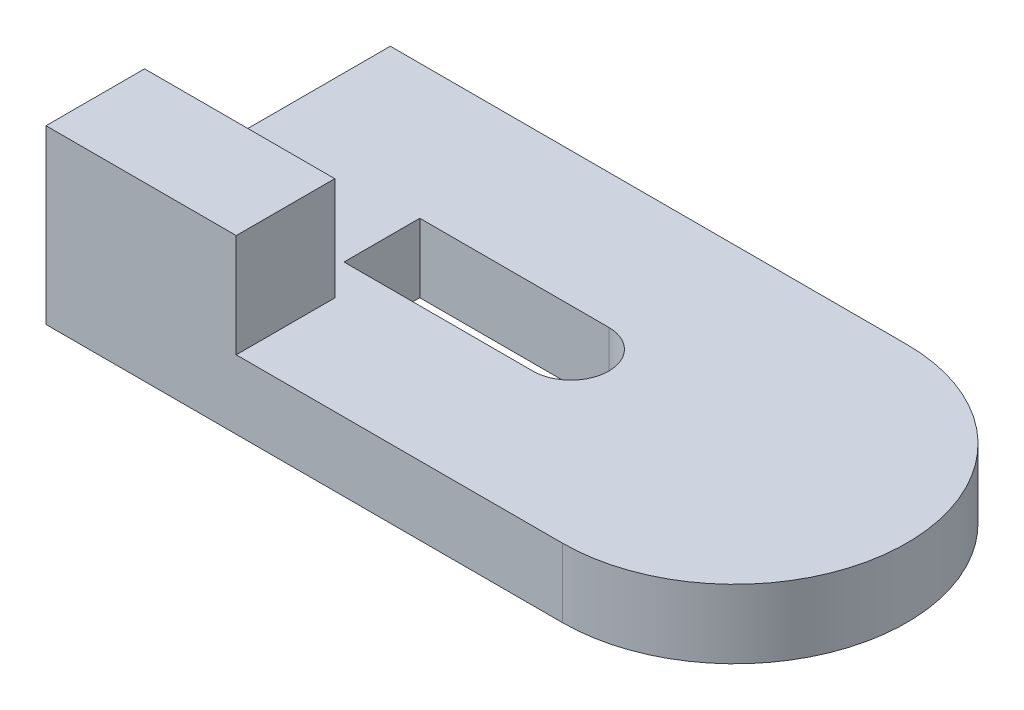
ISO-10303-21;
HEADER;
FILE_DESCRIPTION(('STEP AP214'),'2;1');
FILE_NAME('part.step','',(''),(''),'','','');
FILE_SCHEMA(('AUTOMOTIVE_DESIGN { 1 0 10303 214 1 1 1 1 }'));
ENDSEC;
DATA;
#1=APPLICATION_CONTEXT('core data for automotive mechanical design processes');
#2=APPLICATION_PROTOCOL_DEFINITION('international standard','automotive_design',2000,#1);
#3=PRODUCT_CONTEXT('',#1,'mechanical');
#4=PRODUCT('Part','Part','',(#3));
#5=PRODUCT_RELATED_PRODUCT_CATEGORY('part','',(#4));
#6=PRODUCT_DEFINITION_FORMATION('','',#4);
#7=PRODUCT_DEFINITION_CONTEXT('part definition',#1,'design');
#8=PRODUCT_DEFINITION('design','',#6,#7);
#9=PRODUCT_DEFINITION_SHAPE('','',#8);
#10=(LENGTH_UNIT() NAMED_UNIT(*) SI_UNIT(.MILLI.,.METRE.));
#11=(NAMED_UNIT(*) PLANE_ANGLE_UNIT() SI_UNIT($,.RADIAN.));
#12=(NAMED_UNIT(*) SI_UNIT($,.STERADIAN.) SOLID_ANGLE_UNIT());
#13=UNCERTAINTY_MEASURE_WITH_UNIT(LENGTH_MEASURE(1.E-05),#10,'distance_accuracy_value','');
#14=(GEOMETRIC_REPRESENTATION_CONTEXT(3) GLOBAL_UNCERTAINTY_ASSIGNED_CONTEXT((#13)) GLOBAL_UNIT_ASSIGNED_CONTEXT((#10,
#11,#12)) REPRESENTATION_CONTEXT('',''));
#15=CARTESIAN_POINT('',(0.,0.,0.));
#16=DIRECTION('',(0.,0.,1.));
#17=DIRECTION('',(1.,0.,0.));
#18=AXIS2_PLACEMENT_3D('',#15,#16,#17);
#19=CARTESIAN_POINT('',(75.,20.,0.));
#20=DIRECTION('',(0.,-1.,0.));
#21=DIRECTION('',(0.,0.,-1.));
#22=AXIS2_PLACEMENT_3D('',#19,#20,#21);
#23=CYLINDRICAL_SURFACE('',#22,50.);
#24=CARTESIAN_POINT('',(75.,0.,0.));
#25=DIRECTION('',(0.,1.,0.));
#26=DIRECTION('',(0.,0.,1.));
#27=AXIS2_PLACEMENT_3D('',#24,#25,#26);
#28=CIRCLE('',#27,50.);
#29=CARTESIAN_POINT('',(75.,0.,50.));
#30=VERTEX_POINT('',#29);
#31=CARTESIAN_POINT('',(75.,0.,-50.));
#32=VERTEX_POINT('',#31);
#33=EDGE_CURVE('E183',#30,#32,#28,.T.);
#34=ORIENTED_EDGE('',*,*,#33,.T.);
#35=DIRECTION('',(0.,-1.,0.));
#36=VECTOR('',#35,1.);
#37=CARTESIAN_POINT('',(75.,20.,-50.));
#38=LINE('',#37,#36);
#39=CARTESIAN_POINT('',(75.,20.,-50.));
#40=VERTEX_POINT('',#39);
#41=EDGE_CURVE('E210',#40,#32,#38,.T.);
#42=ORIENTED_EDGE('',*,*,#41,.F.);
#43=CARTESIAN_POINT('',(75.,20.,0.));
#44=DIRECTION('',(0.,1.,0.));
#45=DIRECTION('',(0.,0.,1.));
#46=AXIS2_PLACEMENT_3D('',#43,#44,#45);
#47=CIRCLE('',#46,50.);
#48=CARTESIAN_POINT('',(75.,20.,50.));
#49=VERTEX_POINT('',#48);
#50=EDGE_CURVE('E184',#49,#40,#47,.T.);
#51=ORIENTED_EDGE('',*,*,#50,.F.);
#52=DIRECTION('',(0.,-1.,0.));
#53=VECTOR('',#52,1.);
#54=CARTESIAN_POINT('',(75.,20.,50.));
#55=LINE('',#54,#53);
#56=EDGE_CURVE('E194',#49,#30,#55,.T.);
#57=ORIENTED_EDGE('',*,*,#56,.T.);
#58=EDGE_LOOP('',(#34,#42,#51,#57));
#59=FACE_BOUND('',#58,.T.);
#60=ADVANCED_FACE('F49',(#59),#23,.T.);
#61=CARTESIAN_POINT('',(-75.,20.,-50.));
#62=DIRECTION('',(0.,0.,1.));
#63=DIRECTION('',(1.,0.,0.));
#64=AXIS2_PLACEMENT_3D('',#61,#62,#63);
#65=PLANE('',#64);
#66=DIRECTION('',(-1.,0.,0.));
#67=VECTOR('',#66,1.);
#68=CARTESIAN_POINT('',(-75.,0.,-50.));
#69=LINE('',#68,#67);
#70=CARTESIAN_POINT('',(-75.,0.,-50.));
#71=VERTEX_POINT('',#70);
#72=EDGE_CURVE('E197',#32,#71,#69,.T.);
#73=ORIENTED_EDGE('',*,*,#72,.T.);
#74=DIRECTION('',(0.,-1.,0.));
#75=VECTOR('',#74,1.);
#76=CARTESIAN_POINT('',(-75.,20.,-50.));
#77=LINE('',#76,#75);
#78=CARTESIAN_POINT('',(-75.,20.,-50.));
#79=VERTEX_POINT('',#78);
#80=EDGE_CURVE('E207',#79,#71,#77,.T.);
#81=ORIENTED_EDGE('',*,*,#80,.F.);
#82=DIRECTION('',(-1.,0.,0.));
#83=VECTOR('',#82,1.);
#84=CARTESIAN_POINT('',(-75.,20.,-50.));
#85=LINE('',#84,#83);
#86=EDGE_CURVE('E187',#40,#79,#85,.T.);
#87=ORIENTED_EDGE('',*,*,#86,.F.);
#88=ORIENTED_EDGE('',*,*,#41,.T.);
#89=EDGE_LOOP('',(#73,#81,#87,#88));
#90=FACE_BOUND('',#89,.T.);
#91=ADVANCED_FACE('F235',(#90),#65,.F.);
#92=CARTESIAN_POINT('',(-75.,20.,-50.));
#93=DIRECTION('',(1.,0.,0.));
#94=DIRECTION('',(0.,0.,-1.));
#95=AXIS2_PLACEMENT_3D('',#92,#93,#94);
#96=PLANE('',#95);
#97=DIRECTION('',(0.,0.,1.));
#98=VECTOR('',#97,1.);
#99=CARTESIAN_POINT('',(-75.,0.,-50.));
#100=LINE('',#99,#98);
#101=CARTESIAN_POINT('',(-75.,0.,50.));
#102=VERTEX_POINT('',#101);
#103=EDGE_CURVE('E199',#71,#102,#100,.T.);
#104=ORIENTED_EDGE('',*,*,#103,.T.);
#105=DIRECTION('',(0.,-1.,0.));
#106=VECTOR('',#105,1.);
#107=CARTESIAN_POINT('',(-75.,20.,50.));
#108=LINE('',#107,#106);
#109=CARTESIAN_POINT('',(-75.,50.,50.));
#110=VERTEX_POINT('',#109);
#111=EDGE_CURVE('E204',#110,#102,#108,.T.);
#112=ORIENTED_EDGE('',*,*,#111,.F.);
#113=DIRECTION('',(0.,0.,1.));
#114=VECTOR('',#113,1.);
#115=CARTESIAN_POINT('',(-75.,50.,50.));
#116=LINE('',#115,#114);
#117=CARTESIAN_POINT('',(-75.,50.,21.3811639047776));
#118=VERTEX_POINT('',#117);
#119=EDGE_CURVE('E160',#118,#110,#116,.T.);
#120=ORIENTED_EDGE('',*,*,#119,.F.);
#121=DIRECTION('',(0.,-1.,0.));
#122=VECTOR('',#121,1.);
#123=CARTESIAN_POINT('',(-75.,50.,21.3811639047776));
#124=LINE('',#123,#122);
#125=CARTESIAN_POINT('',(-75.,20.,21.3811639047776));
#126=VERTEX_POINT('',#125);
#127=EDGE_CURVE('E170',#118,#126,#124,.T.);
#128=ORIENTED_EDGE('',*,*,#127,.T.);
#129=DIRECTION('',(0.,0.,1.));
#130=VECTOR('',#129,1.);
#131=CARTESIAN_POINT('',(-75.,20.,-50.));
#132=LINE('',#131,#130);
#133=EDGE_CURVE('E190',#79,#126,#132,.T.);
#134=ORIENTED_EDGE('',*,*,#133,.F.);
#135=ORIENTED_EDGE('',*,*,#80,.T.);
#136=EDGE_LOOP('',(#104,#112,#120,#128,#134,#135));
#137=FACE_BOUND('',#136,.T.);
#138=ADVANCED_FACE('F240',(#137),#96,.F.);
#139=CARTESIAN_POINT('',(-75.,20.,50.));
#140=DIRECTION('',(0.,0.,-1.));
#141=DIRECTION('',(-1.,0.,0.));
#142=AXIS2_PLACEMENT_3D('',#139,#140,#141);
#143=PLANE('',#142);
#144=DIRECTION('',(1.,0.,0.));
#145=VECTOR('',#144,1.);
#146=CARTESIAN_POINT('',(-75.,0.,50.));
#147=LINE('',#146,#145);
#148=EDGE_CURVE('E188',#102,#30,#147,.T.);
#149=ORIENTED_EDGE('',*,*,#148,.T.);
#150=ORIENTED_EDGE('',*,*,#56,.F.);
#151=DIRECTION('',(1.,0.,0.));
#152=VECTOR('',#151,1.);
#153=CARTESIAN_POINT('',(-75.,20.,50.));
#154=LINE('',#153,#152);
#155=CARTESIAN_POINT('',(-19.7456027190128,20.,50.));
#156=VERTEX_POINT('',#155);
#157=EDGE_CURVE('E192',#156,#49,#154,.T.);
#158=ORIENTED_EDGE('',*,*,#157,.F.);
#159=DIRECTION('',(0.,-1.,0.));
#160=VECTOR('',#159,1.);
#161=CARTESIAN_POINT('',(-19.7456027190128,50.,50.));
#162=LINE('',#161,#160);
#163=CARTESIAN_POINT('',(-19.7456027190128,50.,50.));
#164=VERTEX_POINT('',#163);
#165=EDGE_CURVE('E180',#164,#156,#162,.T.);
#166=ORIENTED_EDGE('',*,*,#165,.F.);
#167=DIRECTION('',(1.,0.,0.));
#168=VECTOR('',#167,1.);
#169=CARTESIAN_POINT('',(-75.,50.,50.));
#170=LINE('',#169,#168);
#171=EDGE_CURVE('E163',#110,#164,#170,.T.);
#172=ORIENTED_EDGE('',*,*,#171,.F.);
#173=ORIENTED_EDGE('',*,*,#111,.T.);
#174=EDGE_LOOP('',(#149,#150,#158,#166,#172,#173));
#175=FACE_BOUND('',#174,.T.);
#176=ADVANCED_FACE('F253',(#175),#143,.F.);
#177=CARTESIAN_POINT('',(75.,20.,0.));
#178=DIRECTION('',(0.,1.,0.));
#179=DIRECTION('',(0.,0.,1.));
#180=AXIS2_PLACEMENT_3D('',#177,#178,#179);
#181=PLANE('',#180);
#182=DIRECTION('',(1.,0.,0.));
#183=VECTOR('',#182,1.);
#184=CARTESIAN_POINT('',(0.,20.,11.0088573273505));
#185=LINE('',#184,#183);
#186=CARTESIAN_POINT('',(-27.4435086231808,20.,11.0088573273505));
#187=VERTEX_POINT('',#186);
#188=CARTESIAN_POINT('',(27.4435086231808,20.,11.0088573273505));
#189=VERTEX_POINT('',#188);
#190=EDGE_CURVE('E63',#187,#189,#185,.T.);
#191=ORIENTED_EDGE('',*,*,#190,.F.);
#192=DIRECTION('',(0.,0.,1.));
#193=VECTOR('',#192,1.);
#194=CARTESIAN_POINT('',(-27.4435086231808,20.,0.));
#195=LINE('',#194,#193);
#196=CARTESIAN_POINT('',(-27.4435086231808,20.,-11.0088573273505));
#197=VERTEX_POINT('',#196);
#198=EDGE_CURVE('E150',#197,#187,#195,.T.);
#199=ORIENTED_EDGE('',*,*,#198,.F.);
#200=DIRECTION('',(1.,0.,0.));
#201=VECTOR('',#200,1.);
#202=CARTESIAN_POINT('',(0.,20.,-11.0088573273505));
#203=LINE('',#202,#201);
#204=CARTESIAN_POINT('',(27.4435086231808,20.,-11.0088573273505));
#205=VERTEX_POINT('',#204);
#206=EDGE_CURVE('E134',#197,#205,#203,.T.);
#207=ORIENTED_EDGE('',*,*,#206,.T.);
#208=CARTESIAN_POINT('',(27.4435086231808,20.,0.));
#209=DIRECTION('',(0.,1.,0.));
#210=DIRECTION('',(0.,0.,1.));
#211=AXIS2_PLACEMENT_3D('',#208,#209,#210);
#212=CIRCLE('',#211,11.0088573273505);
#213=EDGE_CURVE('E142',#189,#205,#212,.T.);
#214=ORIENTED_EDGE('',*,*,#213,.F.);
#215=EDGE_LOOP('',(#191,#199,#207,#214));
#216=FACE_BOUND('',#215,.T.);
#217=DIRECTION('',(-1.,0.,0.));
#218=VECTOR('',#217,1.);
#219=CARTESIAN_POINT('',(-75.,20.,21.3811639047776));
#220=LINE('',#219,#218);
#221=CARTESIAN_POINT('',(-19.7456027190128,20.,21.3811639047776));
#222=VERTEX_POINT('',#221);
#223=EDGE_CURVE('E164',#222,#126,#220,.T.);
#224=ORIENTED_EDGE('',*,*,#223,.F.);
#225=DIRECTION('',(0.,0.,-1.));
#226=VECTOR('',#225,1.);
#227=CARTESIAN_POINT('',(-19.7456027190128,20.,50.));
#228=LINE('',#227,#226);
#229=EDGE_CURVE('E156',#156,#222,#228,.T.);
#230=ORIENTED_EDGE('',*,*,#229,.F.);
#231=ORIENTED_EDGE('',*,*,#157,.T.);
#232=ORIENTED_EDGE('',*,*,#50,.T.);
#233=ORIENTED_EDGE('',*,*,#86,.T.);
#234=ORIENTED_EDGE('',*,*,#133,.T.);
#235=EDGE_LOOP('',(#224,#230,#231,#232,#233,#234));
#236=FACE_BOUND('',#235,.T.);
#237=ADVANCED_FACE('F147',(#216,#236),#181,.T.);
#238=CARTESIAN_POINT('',(75.,0.,0.));
#239=DIRECTION('',(0.,1.,0.));
#240=DIRECTION('',(0.,0.,1.));
#241=AXIS2_PLACEMENT_3D('',#238,#239,#240);
#242=PLANE('',#241);
#243=DIRECTION('',(0.,0.,1.));
#244=VECTOR('',#243,1.);
#245=CARTESIAN_POINT('',(-27.4435086231808,0.,0.));
#246=LINE('',#245,#244);
#247=CARTESIAN_POINT('',(-27.4435086231808,0.,-11.0088573273505));
#248=VERTEX_POINT('',#247);
#249=CARTESIAN_POINT('',(-27.4435086231808,0.,11.0088573273505));
#250=VERTEX_POINT('',#249);
#251=EDGE_CURVE('E56',#248,#250,#246,.T.);
#252=ORIENTED_EDGE('',*,*,#251,.T.);
#253=DIRECTION('',(1.,0.,0.));
#254=VECTOR('',#253,1.);
#255=CARTESIAN_POINT('',(75.,0.,11.0088573273505));
#256=LINE('',#255,#254);
#257=CARTESIAN_POINT('',(27.4435086231808,0.,11.0088573273505));
#258=VERTEX_POINT('',#257);
#259=EDGE_CURVE('E12',#250,#258,#256,.T.);
#260=ORIENTED_EDGE('',*,*,#259,.T.);
#261=CARTESIAN_POINT('',(27.4435086231808,0.,0.));
#262=DIRECTION('',(0.,1.,0.));
#263=DIRECTION('',(0.,0.,1.));
#264=AXIS2_PLACEMENT_3D('',#261,#262,#263);
#265=CIRCLE('',#264,11.0088573273505);
#266=CARTESIAN_POINT('',(27.4435086231808,0.,-11.0088573273505));
#267=VERTEX_POINT('',#266);
#268=EDGE_CURVE('E213',#258,#267,#265,.T.);
#269=ORIENTED_EDGE('',*,*,#268,.T.);
#270=DIRECTION('',(1.,0.,0.));
#271=VECTOR('',#270,1.);
#272=CARTESIAN_POINT('',(75.,0.,-11.0088573273505));
#273=LINE('',#272,#271);
#274=EDGE_CURVE('E137',#248,#267,#273,.T.);
#275=ORIENTED_EDGE('',*,*,#274,.F.);
#276=EDGE_LOOP('',(#252,#260,#269,#275));
#277=FACE_BOUND('',#276,.T.);
#278=ORIENTED_EDGE('',*,*,#33,.F.);
#279=ORIENTED_EDGE('',*,*,#148,.F.);
#280=ORIENTED_EDGE('',*,*,#103,.F.);
#281=ORIENTED_EDGE('',*,*,#72,.F.);
#282=EDGE_LOOP('',(#278,#279,#280,#281));
#283=FACE_BOUND('',#282,.T.);
#284=ADVANCED_FACE('F217',(#277,#283),#242,.F.);
#285=CARTESIAN_POINT('',(-19.7456027190128,50.,50.));
#286=DIRECTION('',(-1.,0.,0.));
#287=DIRECTION('',(0.,0.,1.));
#288=AXIS2_PLACEMENT_3D('',#285,#286,#287);
#289=PLANE('',#288);
#290=ORIENTED_EDGE('',*,*,#229,.T.);
#291=DIRECTION('',(0.,-1.,0.));
#292=VECTOR('',#291,1.);
#293=CARTESIAN_POINT('',(-19.7456027190128,50.,21.3811639047776));
#294=LINE('',#293,#292);
#295=CARTESIAN_POINT('',(-19.7456027190128,50.,21.3811639047776));
#296=VERTEX_POINT('',#295);
#297=EDGE_CURVE('E177',#296,#222,#294,.T.);
#298=ORIENTED_EDGE('',*,*,#297,.F.);
#299=DIRECTION('',(0.,0.,-1.));
#300=VECTOR('',#299,1.);
#301=CARTESIAN_POINT('',(-19.7456027190128,50.,50.));
#302=LINE('',#301,#300);
#303=EDGE_CURVE('E166',#164,#296,#302,.T.);
#304=ORIENTED_EDGE('',*,*,#303,.F.);
#305=ORIENTED_EDGE('',*,*,#165,.T.);
#306=EDGE_LOOP('',(#290,#298,#304,#305));
#307=FACE_BOUND('',#306,.T.);
#308=ADVANCED_FACE('F263',(#307),#289,.F.);
#309=CARTESIAN_POINT('',(-75.,50.,21.3811639047776));
#310=DIRECTION('',(0.,0.,1.));
#311=DIRECTION('',(1.,0.,0.));
#312=AXIS2_PLACEMENT_3D('',#309,#310,#311);
#313=PLANE('',#312);
#314=ORIENTED_EDGE('',*,*,#223,.T.);
#315=ORIENTED_EDGE('',*,*,#127,.F.);
#316=DIRECTION('',(-1.,0.,0.));
#317=VECTOR('',#316,1.);
#318=CARTESIAN_POINT('',(-75.,50.,21.3811639047776));
#319=LINE('',#318,#317);
#320=EDGE_CURVE('E168',#296,#118,#319,.T.);
#321=ORIENTED_EDGE('',*,*,#320,.F.);
#322=ORIENTED_EDGE('',*,*,#297,.T.);
#323=EDGE_LOOP('',(#314,#315,#321,#322));
#324=FACE_BOUND('',#323,.T.);
#325=ADVANCED_FACE('F231',(#324),#313,.F.);
#326=CARTESIAN_POINT('',(0.,50.,0.));
#327=DIRECTION('',(0.,-1.,0.));
#328=DIRECTION('',(0.,0.,-1.));
#329=AXIS2_PLACEMENT_3D('',#326,#327,#328);
#330=PLANE('',#329);
#331=ORIENTED_EDGE('',*,*,#119,.T.);
#332=ORIENTED_EDGE('',*,*,#171,.T.);
#333=ORIENTED_EDGE('',*,*,#303,.T.);
#334=ORIENTED_EDGE('',*,*,#320,.T.);
#335=EDGE_LOOP('',(#331,#332,#333,#334));
#336=FACE_BOUND('',#335,.T.);
#337=ADVANCED_FACE('F224',(#336),#330,.F.);
#338=CARTESIAN_POINT('',(0.,-10.,11.0088573273505));
#339=DIRECTION('',(0.,0.,1.));
#340=DIRECTION('',(1.,0.,0.));
#341=AXIS2_PLACEMENT_3D('',#338,#339,#340);
#342=PLANE('',#341);
#343=DIRECTION('',(0.,1.,0.));
#344=VECTOR('',#343,1.);
#345=CARTESIAN_POINT('',(-27.4435086231808,-10.,11.0088573273505));
#346=LINE('',#345,#344);
#347=EDGE_CURVE('E157',#250,#187,#346,.T.);
#348=ORIENTED_EDGE('',*,*,#347,.T.);
#349=ORIENTED_EDGE('',*,*,#190,.T.);
#350=DIRECTION('',(0.,1.,0.));
#351=VECTOR('',#350,1.);
#352=CARTESIAN_POINT('',(27.4435086231808,-10.,11.0088573273505));
#353=LINE('',#352,#351);
#354=EDGE_CURVE('E144',#258,#189,#353,.T.);
#355=ORIENTED_EDGE('',*,*,#354,.F.);
#356=ORIENTED_EDGE('',*,*,#259,.F.);
#357=EDGE_LOOP('',(#348,#349,#355,#356));
#358=FACE_BOUND('',#357,.T.);
#359=ADVANCED_FACE('F222',(#358),#342,.F.);
#360=CARTESIAN_POINT('',(-27.4435086231808,-10.,0.));
#361=DIRECTION('',(-1.,0.,0.));
#362=DIRECTION('',(0.,0.,1.));
#363=AXIS2_PLACEMENT_3D('',#360,#361,#362);
#364=PLANE('',#363);
#365=DIRECTION('',(0.,1.,0.));
#366=VECTOR('',#365,1.);
#367=CARTESIAN_POINT('',(-27.4435086231808,-10.,-11.0088573273505));
#368=LINE('',#367,#366);
#369=EDGE_CURVE('E139',#248,#197,#368,.T.);
#370=ORIENTED_EDGE('',*,*,#369,.T.);
#371=ORIENTED_EDGE('',*,*,#198,.T.);
#372=ORIENTED_EDGE('',*,*,#347,.F.);
#373=ORIENTED_EDGE('',*,*,#251,.F.);
#374=EDGE_LOOP('',(#370,#371,#372,#373));
#375=FACE_BOUND('',#374,.T.);
#376=ADVANCED_FACE('F221',(#375),#364,.F.);
#377=CARTESIAN_POINT('',(0.,-10.,-11.0088573273505));
#378=DIRECTION('',(0.,0.,1.));
#379=DIRECTION('',(1.,0.,0.));
#380=AXIS2_PLACEMENT_3D('',#377,#378,#379);
#381=PLANE('',#380);
#382=ORIENTED_EDGE('',*,*,#274,.T.);
#383=DIRECTION('',(0.,1.,0.));
#384=VECTOR('',#383,1.);
#385=CARTESIAN_POINT('',(27.4435086231808,-10.,-11.0088573273505));
#386=LINE('',#385,#384);
#387=EDGE_CURVE('E71',#267,#205,#386,.T.);
#388=ORIENTED_EDGE('',*,*,#387,.T.);
#389=ORIENTED_EDGE('',*,*,#206,.F.);
#390=ORIENTED_EDGE('',*,*,#369,.F.);
#391=EDGE_LOOP('',(#382,#388,#389,#390));
#392=FACE_BOUND('',#391,.T.);
#393=ADVANCED_FACE('F131',(#392),#381,.T.);
#394=CARTESIAN_POINT('',(27.4435086231808,-10.,0.));
#395=DIRECTION('',(0.,1.,0.));
#396=DIRECTION('',(0.,0.,1.));
#397=AXIS2_PLACEMENT_3D('',#394,#395,#396);
#398=CYLINDRICAL_SURFACE('',#397,11.0088573273505);
#399=ORIENTED_EDGE('',*,*,#354,.T.);
#400=ORIENTED_EDGE('',*,*,#213,.T.);
#401=ORIENTED_EDGE('',*,*,#387,.F.);
#402=ORIENTED_EDGE('',*,*,#268,.F.);
#403=EDGE_LOOP('',(#399,#400,#401,#402));
#404=FACE_BOUND('',#403,.T.);
#405=ADVANCED_FACE('F143',(#404),#398,.F.);
#406=CLOSED_SHELL('',(#60,#91,#138,#176,#237,#284,#308,#325,#337,#359,#376,#393,#405));
#407=MANIFOLD_SOLID_BREP('B2',#406);
#408=ADVANCED_BREP_SHAPE_REPRESENTATION('',(#18,#407),#14);
#409=SHAPE_DEFINITION_REPRESENTATION(#9,#408);
ENDSEC;
END-ISO-10303-21;
